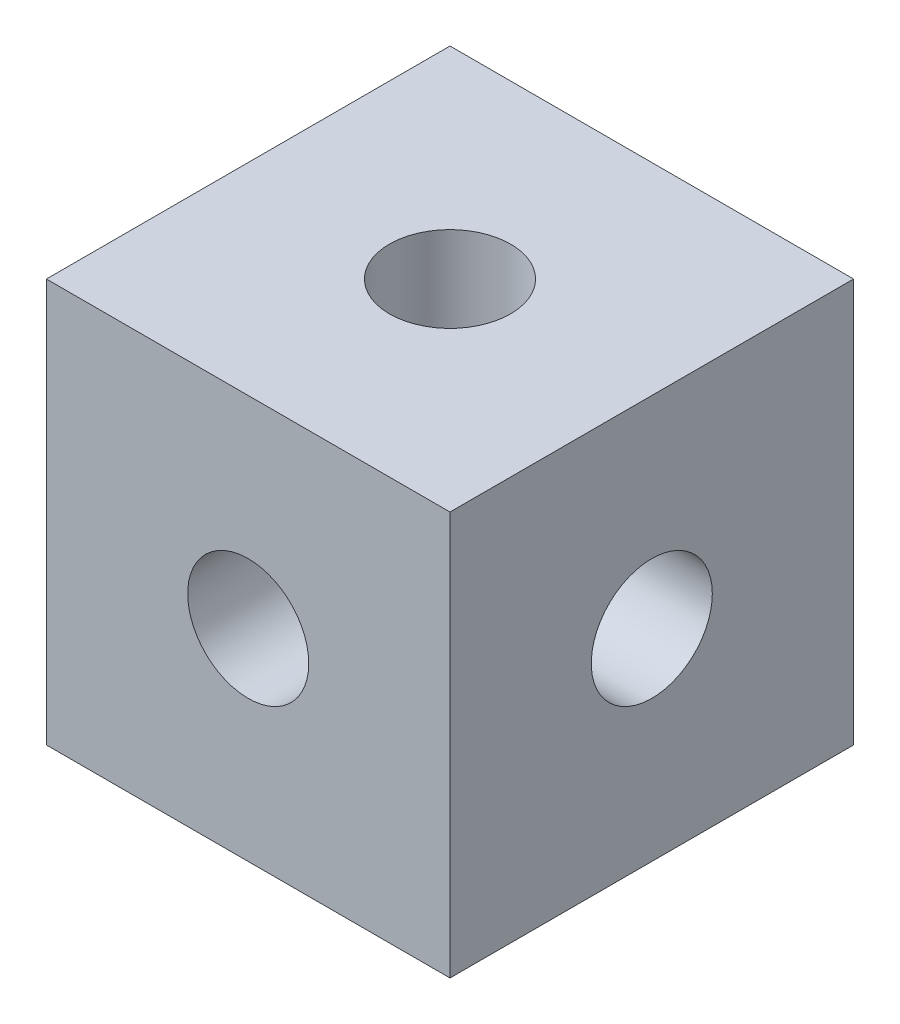
ISO-10303-21;
HEADER;
FILE_DESCRIPTION(('STEP AP214'),'2;1');
FILE_NAME('part.step','',(''),(''),'','','');
FILE_SCHEMA(('AUTOMOTIVE_DESIGN { 1 0 10303 214 1 1 1 1 }'));
ENDSEC;
DATA;
#1=APPLICATION_CONTEXT('core data for automotive mechanical design processes');
#2=APPLICATION_PROTOCOL_DEFINITION('international standard','automotive_design',2000,#1);
#3=PRODUCT_CONTEXT('',#1,'mechanical');
#4=PRODUCT('Part','Part','',(#3));
#5=PRODUCT_RELATED_PRODUCT_CATEGORY('part','',(#4));
#6=PRODUCT_DEFINITION_FORMATION('','',#4);
#7=PRODUCT_DEFINITION_CONTEXT('part definition',#1,'design');
#8=PRODUCT_DEFINITION('design','',#6,#7);
#9=PRODUCT_DEFINITION_SHAPE('','',#8);
#10=(LENGTH_UNIT() NAMED_UNIT(*) SI_UNIT(.MILLI.,.METRE.));
#11=(NAMED_UNIT(*) PLANE_ANGLE_UNIT() SI_UNIT($,.RADIAN.));
#12=(NAMED_UNIT(*) SI_UNIT($,.STERADIAN.) SOLID_ANGLE_UNIT());
#13=UNCERTAINTY_MEASURE_WITH_UNIT(LENGTH_MEASURE(1.E-05),#10,'distance_accuracy_value','');
#14=(GEOMETRIC_REPRESENTATION_CONTEXT(3) GLOBAL_UNCERTAINTY_ASSIGNED_CONTEXT((#13)) GLOBAL_UNIT_ASSIGNED_CONTEXT((#10,
#11,#12)) REPRESENTATION_CONTEXT('',''));
#15=CARTESIAN_POINT('',(0.,0.,0.));
#16=DIRECTION('',(0.,0.,1.));
#17=DIRECTION('',(1.,0.,0.));
#18=AXIS2_PLACEMENT_3D('',#15,#16,#17);
#19=CARTESIAN_POINT('',(5.,0.,5.));
#20=DIRECTION('',(0.,1.,0.));
#21=DIRECTION('',(0.,0.,1.));
#22=AXIS2_PLACEMENT_3D('',#19,#20,#21);
#23=CYLINDRICAL_SURFACE('',#22,1.5);
#24=CARTESIAN_POINT('',(5.,10.,5.));
#25=DIRECTION('',(0.,1.,0.));
#26=DIRECTION('',(0.,0.,1.));
#27=AXIS2_PLACEMENT_3D('',#24,#25,#26);
#28=CIRCLE('',#27,1.5);
#29=CARTESIAN_POINT('',(5.,10.,6.5));
#30=VERTEX_POINT('',#29);
#31=EDGE_CURVE('E144',#30,#30,#28,.T.);
#32=ORIENTED_EDGE('',*,*,#31,.T.);
#33=EDGE_LOOP('',(#32));
#34=FACE_BOUND('',#33,.T.);
#35=CARTESIAN_POINT('',(5.,5.,5.));
#36=DIRECTION('',(0.707106781186547,0.707106781186547,0.));
#37=DIRECTION('',(-0.707106781186547,0.707106781186547,0.));
#38=AXIS2_PLACEMENT_3D('',#35,#36,#37);
#39=ELLIPSE('',#38,2.12132034355964,1.5);
#40=CARTESIAN_POINT('',(3.93933982822018,6.06066017177982,6.06066017177982));
#41=VERTEX_POINT('',#40);
#42=CARTESIAN_POINT('',(3.93933982822018,6.06066017177982,3.93933982822018));
#43=VERTEX_POINT('',#42);
#44=EDGE_CURVE('E108',#41,#43,#39,.F.);
#45=ORIENTED_EDGE('',*,*,#44,.T.);
#46=CARTESIAN_POINT('',(5.,5.,5.));
#47=DIRECTION('',(0.,0.707106781186547,0.707106781186547));
#48=DIRECTION('',(0.,0.707106781186547,-0.707106781186547));
#49=AXIS2_PLACEMENT_3D('',#46,#47,#48);
#50=ELLIPSE('',#49,2.12132034355964,1.5);
#51=CARTESIAN_POINT('',(6.06066017177982,6.06066017177982,3.93933982822018));
#52=VERTEX_POINT('',#51);
#53=EDGE_CURVE('E54',#43,#52,#50,.F.);
#54=ORIENTED_EDGE('',*,*,#53,.T.);
#55=CARTESIAN_POINT('',(5.,5.,5.));
#56=DIRECTION('',(-0.707106781186547,0.707106781186547,0.));
#57=DIRECTION('',(0.707106781186547,0.707106781186547,0.));
#58=AXIS2_PLACEMENT_3D('',#55,#56,#57);
#59=ELLIPSE('',#58,2.12132034355964,1.5);
#60=CARTESIAN_POINT('',(6.06066017177982,6.06066017177982,6.06066017177982));
#61=VERTEX_POINT('',#60);
#62=EDGE_CURVE('E120',#52,#61,#59,.F.);
#63=ORIENTED_EDGE('',*,*,#62,.T.);
#64=CARTESIAN_POINT('',(5.,5.,5.));
#65=DIRECTION('',(0.,0.707106781186547,-0.707106781186547));
#66=DIRECTION('',(0.,0.707106781186547,0.707106781186547));
#67=AXIS2_PLACEMENT_3D('',#64,#65,#66);
#68=ELLIPSE('',#67,2.12132034355964,1.5);
#69=EDGE_CURVE('E131',#61,#41,#68,.F.);
#70=ORIENTED_EDGE('',*,*,#69,.T.);
#71=EDGE_LOOP('',(#45,#54,#63,#70));
#72=FACE_BOUND('',#71,.T.);
#73=ADVANCED_FACE('F39',(#34,#72),#23,.F.);
#74=CARTESIAN_POINT('',(0.,0.,10.));
#75=DIRECTION('',(1.,0.,0.));
#76=DIRECTION('',(0.,0.,-1.));
#77=AXIS2_PLACEMENT_3D('',#74,#75,#76);
#78=PLANE('',#77);
#79=CARTESIAN_POINT('',(0.,5.,5.));
#80=DIRECTION('',(1.,0.,0.));
#81=DIRECTION('',(0.,0.,-1.));
#82=AXIS2_PLACEMENT_3D('',#79,#80,#81);
#83=CIRCLE('',#82,1.5);
#84=CARTESIAN_POINT('',(0.,5.,3.5));
#85=VERTEX_POINT('',#84);
#86=EDGE_CURVE('E141',#85,#85,#83,.T.);
#87=ORIENTED_EDGE('',*,*,#86,.T.);
#88=EDGE_LOOP('',(#87));
#89=FACE_BOUND('',#88,.T.);
#90=DIRECTION('',(0.,-1.,0.));
#91=VECTOR('',#90,1.);
#92=CARTESIAN_POINT('',(0.,0.,0.));
#93=LINE('',#92,#91);
#94=CARTESIAN_POINT('',(0.,10.,0.));
#95=VERTEX_POINT('',#94);
#96=CARTESIAN_POINT('',(0.,0.,0.));
#97=VERTEX_POINT('',#96);
#98=EDGE_CURVE('E150',#95,#97,#93,.T.);
#99=ORIENTED_EDGE('',*,*,#98,.T.);
#100=DIRECTION('',(0.,0.,-1.));
#101=VECTOR('',#100,1.);
#102=CARTESIAN_POINT('',(0.,0.,10.));
#103=LINE('',#102,#101);
#104=CARTESIAN_POINT('',(0.,0.,10.));
#105=VERTEX_POINT('',#104);
#106=EDGE_CURVE('E124',#105,#97,#103,.T.);
#107=ORIENTED_EDGE('',*,*,#106,.F.);
#108=DIRECTION('',(0.,-1.,0.));
#109=VECTOR('',#108,1.);
#110=CARTESIAN_POINT('',(0.,0.,10.));
#111=LINE('',#110,#109);
#112=CARTESIAN_POINT('',(0.,10.,10.));
#113=VERTEX_POINT('',#112);
#114=EDGE_CURVE('E153',#113,#105,#111,.T.);
#115=ORIENTED_EDGE('',*,*,#114,.F.);
#116=DIRECTION('',(0.,0.,-1.));
#117=VECTOR('',#116,1.);
#118=CARTESIAN_POINT('',(0.,10.,10.));
#119=LINE('',#118,#117);
#120=EDGE_CURVE('E163',#113,#95,#119,.T.);
#121=ORIENTED_EDGE('',*,*,#120,.T.);
#122=EDGE_LOOP('',(#99,#107,#115,#121));
#123=FACE_BOUND('',#122,.T.);
#124=ADVANCED_FACE('F41',(#89,#123),#78,.F.);
#125=CARTESIAN_POINT('',(0.,0.,10.));
#126=DIRECTION('',(0.,1.,0.));
#127=DIRECTION('',(0.,0.,1.));
#128=AXIS2_PLACEMENT_3D('',#125,#126,#127);
#129=PLANE('',#128);
#130=CARTESIAN_POINT('',(5.,0.,5.));
#131=DIRECTION('',(0.,1.,0.));
#132=DIRECTION('',(0.,0.,1.));
#133=AXIS2_PLACEMENT_3D('',#130,#131,#132);
#134=CIRCLE('',#133,1.5);
#135=CARTESIAN_POINT('',(5.,0.,6.5));
#136=VERTEX_POINT('',#135);
#137=EDGE_CURVE('E147',#136,#136,#134,.T.);
#138=ORIENTED_EDGE('',*,*,#137,.T.);
#139=EDGE_LOOP('',(#138));
#140=FACE_BOUND('',#139,.T.);
#141=DIRECTION('',(1.,0.,0.));
#142=VECTOR('',#141,1.);
#143=CARTESIAN_POINT('',(0.,0.,0.));
#144=LINE('',#143,#142);
#145=CARTESIAN_POINT('',(10.,0.,0.));
#146=VERTEX_POINT('',#145);
#147=EDGE_CURVE('E166',#97,#146,#144,.T.);
#148=ORIENTED_EDGE('',*,*,#147,.T.);
#149=DIRECTION('',(0.,0.,-1.));
#150=VECTOR('',#149,1.);
#151=CARTESIAN_POINT('',(10.,0.,10.));
#152=LINE('',#151,#150);
#153=CARTESIAN_POINT('',(10.,0.,10.));
#154=VERTEX_POINT('',#153);
#155=EDGE_CURVE('E176',#154,#146,#152,.T.);
#156=ORIENTED_EDGE('',*,*,#155,.F.);
#157=DIRECTION('',(1.,0.,0.));
#158=VECTOR('',#157,1.);
#159=CARTESIAN_POINT('',(0.,0.,10.));
#160=LINE('',#159,#158);
#161=EDGE_CURVE('E156',#105,#154,#160,.T.);
#162=ORIENTED_EDGE('',*,*,#161,.F.);
#163=ORIENTED_EDGE('',*,*,#106,.T.);
#164=EDGE_LOOP('',(#148,#156,#162,#163));
#165=FACE_BOUND('',#164,.T.);
#166=ADVANCED_FACE('F181',(#140,#165),#129,.F.);
#167=CARTESIAN_POINT('',(10.,0.,10.));
#168=DIRECTION('',(-1.,0.,0.));
#169=DIRECTION('',(0.,0.,1.));
#170=AXIS2_PLACEMENT_3D('',#167,#168,#169);
#171=PLANE('',#170);
#172=CARTESIAN_POINT('',(10.,5.,5.));
#173=DIRECTION('',(1.,0.,0.));
#174=DIRECTION('',(0.,0.,-1.));
#175=AXIS2_PLACEMENT_3D('',#172,#173,#174);
#176=CIRCLE('',#175,1.5);
#177=CARTESIAN_POINT('',(10.,5.,3.5));
#178=VERTEX_POINT('',#177);
#179=EDGE_CURVE('E135',#178,#178,#176,.T.);
#180=ORIENTED_EDGE('',*,*,#179,.F.);
#181=EDGE_LOOP('',(#180));
#182=FACE_BOUND('',#181,.T.);
#183=DIRECTION('',(0.,1.,0.));
#184=VECTOR('',#183,1.);
#185=CARTESIAN_POINT('',(10.,0.,0.));
#186=LINE('',#185,#184);
#187=CARTESIAN_POINT('',(10.,10.,0.));
#188=VERTEX_POINT('',#187);
#189=EDGE_CURVE('E168',#146,#188,#186,.T.);
#190=ORIENTED_EDGE('',*,*,#189,.T.);
#191=DIRECTION('',(0.,0.,-1.));
#192=VECTOR('',#191,1.);
#193=CARTESIAN_POINT('',(10.,10.,10.));
#194=LINE('',#193,#192);
#195=CARTESIAN_POINT('',(10.,10.,10.));
#196=VERTEX_POINT('',#195);
#197=EDGE_CURVE('E173',#196,#188,#194,.T.);
#198=ORIENTED_EDGE('',*,*,#197,.F.);
#199=DIRECTION('',(0.,1.,0.));
#200=VECTOR('',#199,1.);
#201=CARTESIAN_POINT('',(10.,0.,10.));
#202=LINE('',#201,#200);
#203=EDGE_CURVE('E159',#154,#196,#202,.T.);
#204=ORIENTED_EDGE('',*,*,#203,.F.);
#205=ORIENTED_EDGE('',*,*,#155,.T.);
#206=EDGE_LOOP('',(#190,#198,#204,#205));
#207=FACE_BOUND('',#206,.T.);
#208=ADVANCED_FACE('F193',(#182,#207),#171,.F.);
#209=CARTESIAN_POINT('',(0.,10.,10.));
#210=DIRECTION('',(0.,-1.,0.));
#211=DIRECTION('',(0.,0.,-1.));
#212=AXIS2_PLACEMENT_3D('',#209,#210,#211);
#213=PLANE('',#212);
#214=ORIENTED_EDGE('',*,*,#31,.F.);
#215=EDGE_LOOP('',(#214));
#216=FACE_BOUND('',#215,.T.);
#217=DIRECTION('',(-1.,0.,0.));
#218=VECTOR('',#217,1.);
#219=CARTESIAN_POINT('',(0.,10.,0.));
#220=LINE('',#219,#218);
#221=EDGE_CURVE('E157',#188,#95,#220,.T.);
#222=ORIENTED_EDGE('',*,*,#221,.T.);
#223=ORIENTED_EDGE('',*,*,#120,.F.);
#224=DIRECTION('',(-1.,0.,0.));
#225=VECTOR('',#224,1.);
#226=CARTESIAN_POINT('',(0.,10.,10.));
#227=LINE('',#226,#225);
#228=EDGE_CURVE('E161',#196,#113,#227,.T.);
#229=ORIENTED_EDGE('',*,*,#228,.F.);
#230=ORIENTED_EDGE('',*,*,#197,.T.);
#231=EDGE_LOOP('',(#222,#223,#229,#230));
#232=FACE_BOUND('',#231,.T.);
#233=ADVANCED_FACE('F197',(#216,#232),#213,.F.);
#234=CARTESIAN_POINT('',(0.,0.,10.));
#235=DIRECTION('',(0.,0.,-1.));
#236=DIRECTION('',(-1.,0.,0.));
#237=AXIS2_PLACEMENT_3D('',#234,#235,#236);
#238=PLANE('',#237);
#239=CARTESIAN_POINT('',(5.,5.,10.));
#240=DIRECTION('',(0.,0.,1.));
#241=DIRECTION('',(1.,0.,0.));
#242=AXIS2_PLACEMENT_3D('',#239,#240,#241);
#243=CIRCLE('',#242,1.5);
#244=CARTESIAN_POINT('',(6.5,5.,10.));
#245=VERTEX_POINT('',#244);
#246=EDGE_CURVE('E241',#245,#245,#243,.T.);
#247=ORIENTED_EDGE('',*,*,#246,.F.);
#248=EDGE_LOOP('',(#247));
#249=FACE_BOUND('',#248,.T.);
#250=ORIENTED_EDGE('',*,*,#114,.T.);
#251=ORIENTED_EDGE('',*,*,#161,.T.);
#252=ORIENTED_EDGE('',*,*,#203,.T.);
#253=ORIENTED_EDGE('',*,*,#228,.T.);
#254=EDGE_LOOP('',(#250,#251,#252,#253));
#255=FACE_BOUND('',#254,.T.);
#256=ADVANCED_FACE('F199',(#249,#255),#238,.F.);
#257=CARTESIAN_POINT('',(0.,0.,0.));
#258=DIRECTION('',(0.,0.,-1.));
#259=DIRECTION('',(-1.,0.,0.));
#260=AXIS2_PLACEMENT_3D('',#257,#258,#259);
#261=PLANE('',#260);
#262=CARTESIAN_POINT('',(5.,5.,0.));
#263=DIRECTION('',(0.,0.,1.));
#264=DIRECTION('',(1.,0.,0.));
#265=AXIS2_PLACEMENT_3D('',#262,#263,#264);
#266=CIRCLE('',#265,1.5);
#267=CARTESIAN_POINT('',(6.5,5.,0.));
#268=VERTEX_POINT('',#267);
#269=EDGE_CURVE('E117',#268,#268,#266,.T.);
#270=ORIENTED_EDGE('',*,*,#269,.T.);
#271=EDGE_LOOP('',(#270));
#272=FACE_BOUND('',#271,.T.);
#273=ORIENTED_EDGE('',*,*,#98,.F.);
#274=ORIENTED_EDGE('',*,*,#221,.F.);
#275=ORIENTED_EDGE('',*,*,#189,.F.);
#276=ORIENTED_EDGE('',*,*,#147,.F.);
#277=EDGE_LOOP('',(#273,#274,#275,#276));
#278=FACE_BOUND('',#277,.T.);
#279=ADVANCED_FACE('F189',(#272,#278),#261,.T.);
#280=CARTESIAN_POINT('',(5.,5.,5.));
#281=DIRECTION('',(-0.707106781186547,0.707106781186547,0.));
#282=DIRECTION('',(0.707106781186547,0.707106781186547,0.));
#283=AXIS2_PLACEMENT_3D('',#280,#281,#282);
#284=ELLIPSE('',#283,2.12132034355964,1.5);
#285=CARTESIAN_POINT('',(3.93933982822018,3.93933982822018,3.93933982822018));
#286=VERTEX_POINT('',#285);
#287=CARTESIAN_POINT('',(3.93933982822018,3.93933982822018,6.06066017177982));
#288=VERTEX_POINT('',#287);
#289=EDGE_CURVE('E114',#286,#288,#284,.T.);
#290=ORIENTED_EDGE('',*,*,#289,.T.);
#291=CARTESIAN_POINT('',(5.,5.,5.));
#292=DIRECTION('',(0.,0.707106781186547,0.707106781186547));
#293=DIRECTION('',(0.,0.707106781186547,-0.707106781186547));
#294=AXIS2_PLACEMENT_3D('',#291,#292,#293);
#295=ELLIPSE('',#294,2.12132034355964,1.5);
#296=CARTESIAN_POINT('',(6.06066017177982,3.93933982822018,6.06066017177982));
#297=VERTEX_POINT('',#296);
#298=EDGE_CURVE('E62',#288,#297,#295,.T.);
#299=ORIENTED_EDGE('',*,*,#298,.T.);
#300=CARTESIAN_POINT('',(5.,5.,5.));
#301=DIRECTION('',(0.707106781186547,0.707106781186547,0.));
#302=DIRECTION('',(-0.707106781186547,0.707106781186547,0.));
#303=AXIS2_PLACEMENT_3D('',#300,#301,#302);
#304=ELLIPSE('',#303,2.12132034355964,1.5);
#305=CARTESIAN_POINT('',(6.06066017177982,3.93933982822018,3.93933982822018));
#306=VERTEX_POINT('',#305);
#307=EDGE_CURVE('E116',#297,#306,#304,.T.);
#308=ORIENTED_EDGE('',*,*,#307,.T.);
#309=CARTESIAN_POINT('',(5.,5.,5.));
#310=DIRECTION('',(0.,0.707106781186547,-0.707106781186547));
#311=DIRECTION('',(0.,0.707106781186547,0.707106781186547));
#312=AXIS2_PLACEMENT_3D('',#309,#310,#311);
#313=ELLIPSE('',#312,2.12132034355964,1.5);
#314=EDGE_CURVE('E102',#306,#286,#313,.T.);
#315=ORIENTED_EDGE('',*,*,#314,.T.);
#316=EDGE_LOOP('',(#290,#299,#308,#315));
#317=FACE_BOUND('',#316,.T.);
#318=ORIENTED_EDGE('',*,*,#137,.F.);
#319=EDGE_LOOP('',(#318));
#320=FACE_BOUND('',#319,.T.);
#321=ADVANCED_FACE('F112',(#317,#320),#23,.F.);
#322=CARTESIAN_POINT('',(0.,5.,5.));
#323=DIRECTION('',(1.,0.,0.));
#324=DIRECTION('',(0.,0.,-1.));
#325=AXIS2_PLACEMENT_3D('',#322,#323,#324);
#326=CYLINDRICAL_SURFACE('',#325,1.5);
#327=ORIENTED_EDGE('',*,*,#179,.T.);
#328=EDGE_LOOP('',(#327));
#329=FACE_BOUND('',#328,.T.);
#330=ORIENTED_EDGE('',*,*,#62,.F.);
#331=CARTESIAN_POINT('',(5.,5.,5.));
#332=DIRECTION('',(0.707106781186547,0.,0.707106781186547));
#333=DIRECTION('',(0.707106781186547,0.,-0.707106781186547));
#334=AXIS2_PLACEMENT_3D('',#331,#332,#333);
#335=ELLIPSE('',#334,2.12132034355964,1.5);
#336=EDGE_CURVE('E137',#52,#306,#335,.F.);
#337=ORIENTED_EDGE('',*,*,#336,.T.);
#338=ORIENTED_EDGE('',*,*,#307,.F.);
#339=CARTESIAN_POINT('',(5.,5.,5.));
#340=DIRECTION('',(0.707106781186547,0.,-0.707106781186547));
#341=DIRECTION('',(0.707106781186547,0.,0.707106781186547));
#342=AXIS2_PLACEMENT_3D('',#339,#340,#341);
#343=ELLIPSE('',#342,2.12132034355964,1.5);
#344=EDGE_CURVE('E133',#297,#61,#343,.F.);
#345=ORIENTED_EDGE('',*,*,#344,.T.);
#346=EDGE_LOOP('',(#330,#337,#338,#345));
#347=FACE_BOUND('',#346,.T.);
#348=ADVANCED_FACE('F222',(#329,#347),#326,.F.);
#349=ORIENTED_EDGE('',*,*,#86,.F.);
#350=EDGE_LOOP('',(#349));
#351=FACE_BOUND('',#350,.T.);
#352=ORIENTED_EDGE('',*,*,#44,.F.);
#353=CARTESIAN_POINT('',(5.,5.,5.));
#354=DIRECTION('',(0.707106781186547,0.,0.707106781186547));
#355=DIRECTION('',(0.707106781186547,0.,-0.707106781186547));
#356=AXIS2_PLACEMENT_3D('',#353,#354,#355);
#357=ELLIPSE('',#356,2.12132034355964,1.5);
#358=EDGE_CURVE('E11',#41,#288,#357,.T.);
#359=ORIENTED_EDGE('',*,*,#358,.T.);
#360=ORIENTED_EDGE('',*,*,#289,.F.);
#361=CARTESIAN_POINT('',(5.,5.,5.));
#362=DIRECTION('',(0.707106781186547,0.,-0.707106781186547));
#363=DIRECTION('',(0.707106781186547,0.,0.707106781186547));
#364=AXIS2_PLACEMENT_3D('',#361,#362,#363);
#365=ELLIPSE('',#364,2.12132034355964,1.5);
#366=EDGE_CURVE('E47',#286,#43,#365,.T.);
#367=ORIENTED_EDGE('',*,*,#366,.T.);
#368=EDGE_LOOP('',(#352,#359,#360,#367));
#369=FACE_BOUND('',#368,.T.);
#370=ADVANCED_FACE('F119',(#351,#369),#326,.F.);
#371=CARTESIAN_POINT('',(5.,5.,0.));
#372=DIRECTION('',(0.,0.,1.));
#373=DIRECTION('',(1.,0.,0.));
#374=AXIS2_PLACEMENT_3D('',#371,#372,#373);
#375=CYLINDRICAL_SURFACE('',#374,1.5);
#376=ORIENTED_EDGE('',*,*,#269,.F.);
#377=EDGE_LOOP('',(#376));
#378=FACE_BOUND('',#377,.T.);
#379=ORIENTED_EDGE('',*,*,#53,.F.);
#380=ORIENTED_EDGE('',*,*,#366,.F.);
#381=ORIENTED_EDGE('',*,*,#314,.F.);
#382=ORIENTED_EDGE('',*,*,#336,.F.);
#383=EDGE_LOOP('',(#379,#380,#381,#382));
#384=FACE_BOUND('',#383,.T.);
#385=ADVANCED_FACE('F101',(#378,#384),#375,.F.);
#386=ORIENTED_EDGE('',*,*,#246,.T.);
#387=EDGE_LOOP('',(#386));
#388=FACE_BOUND('',#387,.T.);
#389=ORIENTED_EDGE('',*,*,#298,.F.);
#390=ORIENTED_EDGE('',*,*,#358,.F.);
#391=ORIENTED_EDGE('',*,*,#69,.F.);
#392=ORIENTED_EDGE('',*,*,#344,.F.);
#393=EDGE_LOOP('',(#389,#390,#391,#392));
#394=FACE_BOUND('',#393,.T.);
#395=ADVANCED_FACE('F233',(#388,#394),#375,.F.);
#396=CLOSED_SHELL('',(#73,#124,#166,#208,#233,#256,#279,#321,#348,#370,#385,#395));
#397=MANIFOLD_SOLID_BREP('B2',#396);
#398=ADVANCED_BREP_SHAPE_REPRESENTATION('',(#18,#397),#14);
#399=SHAPE_DEFINITION_REPRESENTATION(#9,#398);
ENDSEC;
END-ISO-10303-21;
